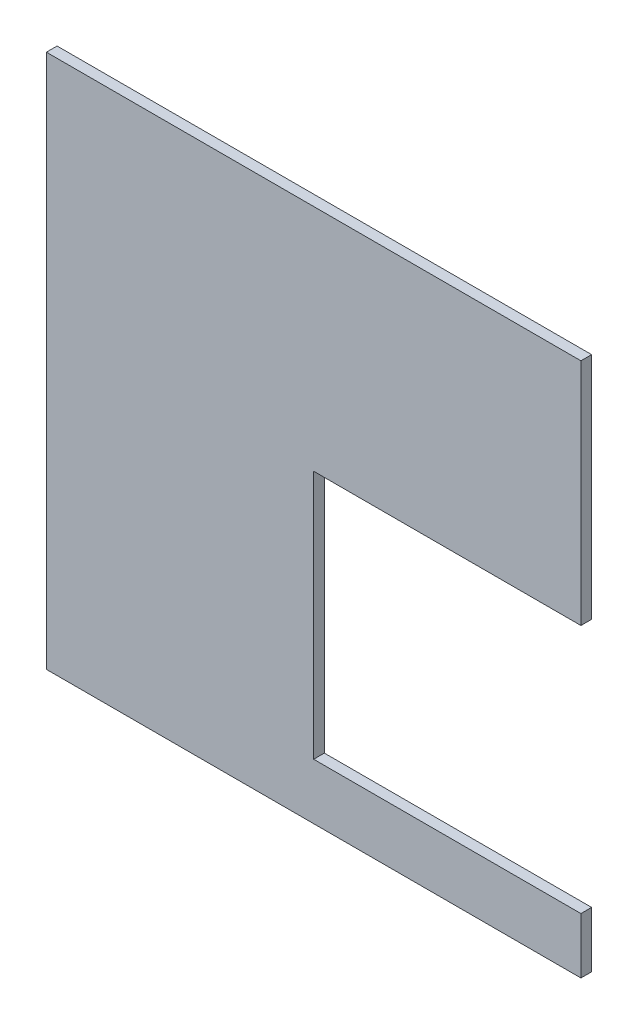
ISO-10303-21;
HEADER;
FILE_DESCRIPTION(('STEP AP214'),'2;1');
FILE_NAME('part.step','',(''),(''),'','','');
FILE_SCHEMA(('AUTOMOTIVE_DESIGN { 1 0 10303 214 1 1 1 1 }'));
ENDSEC;
DATA;
#1=APPLICATION_CONTEXT('core data for automotive mechanical design processes');
#2=APPLICATION_PROTOCOL_DEFINITION('international standard','automotive_design',2000,#1);
#3=PRODUCT_CONTEXT('',#1,'mechanical');
#4=PRODUCT('Part','Part','',(#3));
#5=PRODUCT_RELATED_PRODUCT_CATEGORY('part','',(#4));
#6=PRODUCT_DEFINITION_FORMATION('','',#4);
#7=PRODUCT_DEFINITION_CONTEXT('part definition',#1,'design');
#8=PRODUCT_DEFINITION('design','',#6,#7);
#9=PRODUCT_DEFINITION_SHAPE('','',#8);
#10=(LENGTH_UNIT() NAMED_UNIT(*) SI_UNIT(.MILLI.,.METRE.));
#11=(NAMED_UNIT(*) PLANE_ANGLE_UNIT() SI_UNIT($,.RADIAN.));
#12=(NAMED_UNIT(*) SI_UNIT($,.STERADIAN.) SOLID_ANGLE_UNIT());
#13=UNCERTAINTY_MEASURE_WITH_UNIT(LENGTH_MEASURE(1.E-05),#10,'distance_accuracy_value','');
#14=(GEOMETRIC_REPRESENTATION_CONTEXT(3) GLOBAL_UNCERTAINTY_ASSIGNED_CONTEXT((#13)) GLOBAL_UNIT_ASSIGNED_CONTEXT((#10,
#11,#12)) REPRESENTATION_CONTEXT('',''));
#15=CARTESIAN_POINT('',(0.,0.,0.));
#16=DIRECTION('',(0.,0.,1.));
#17=DIRECTION('',(1.,0.,0.));
#18=AXIS2_PLACEMENT_3D('',#15,#16,#17);
#19=CARTESIAN_POINT('',(75.,-75.,3.));
#20=DIRECTION('',(-1.,0.,0.));
#21=DIRECTION('',(0.,0.,1.));
#22=AXIS2_PLACEMENT_3D('',#19,#20,#21);
#23=PLANE('',#22);
#24=DIRECTION('',(0.,1.,0.));
#25=VECTOR('',#24,1.);
#26=CARTESIAN_POINT('',(75.,-75.,0.));
#27=LINE('',#26,#25);
#28=CARTESIAN_POINT('',(75.,-75.,0.));
#29=VERTEX_POINT('',#28);
#30=CARTESIAN_POINT('',(75.,-59.3380306855874,0.));
#31=VERTEX_POINT('',#30);
#32=EDGE_CURVE('E127',#29,#31,#27,.T.);
#33=ORIENTED_EDGE('',*,*,#32,.T.);
#34=DIRECTION('',(0.,0.,1.));
#35=VECTOR('',#34,1.);
#36=CARTESIAN_POINT('',(75.,-59.3380306855874,0.));
#37=LINE('',#36,#35);
#38=CARTESIAN_POINT('',(75.,-59.3380306855874,3.));
#39=VERTEX_POINT('',#38);
#40=EDGE_CURVE('E159',#31,#39,#37,.T.);
#41=ORIENTED_EDGE('',*,*,#40,.T.);
#42=DIRECTION('',(0.,1.,0.));
#43=VECTOR('',#42,1.);
#44=CARTESIAN_POINT('',(75.,-75.,3.));
#45=LINE('',#44,#43);
#46=CARTESIAN_POINT('',(75.,-75.,3.));
#47=VERTEX_POINT('',#46);
#48=EDGE_CURVE('E146',#47,#39,#45,.T.);
#49=ORIENTED_EDGE('',*,*,#48,.F.);
#50=DIRECTION('',(0.,0.,-1.));
#51=VECTOR('',#50,1.);
#52=CARTESIAN_POINT('',(75.,-75.,3.));
#53=LINE('',#52,#51);
#54=EDGE_CURVE('E41',#47,#29,#53,.T.);
#55=ORIENTED_EDGE('',*,*,#54,.T.);
#56=EDGE_LOOP('',(#33,#41,#49,#55));
#57=FACE_BOUND('',#56,.T.);
#58=ADVANCED_FACE('F33',(#57),#23,.F.);
#59=CARTESIAN_POINT('',(-75.,-75.,3.));
#60=DIRECTION('',(1.,0.,0.));
#61=DIRECTION('',(0.,1.,0.));
#62=AXIS2_PLACEMENT_3D('',#59,#60,#61);
#63=PLANE('',#62);
#64=DIRECTION('',(0.,-1.,0.));
#65=VECTOR('',#64,1.);
#66=CARTESIAN_POINT('',(-75.,-75.,0.));
#67=LINE('',#66,#65);
#68=CARTESIAN_POINT('',(-75.,75.,0.));
#69=VERTEX_POINT('',#68);
#70=CARTESIAN_POINT('',(-75.,-75.,0.));
#71=VERTEX_POINT('',#70);
#72=EDGE_CURVE('E131',#69,#71,#67,.T.);
#73=ORIENTED_EDGE('',*,*,#72,.T.);
#74=DIRECTION('',(0.,0.,-1.));
#75=VECTOR('',#74,1.);
#76=CARTESIAN_POINT('',(-75.,-75.,3.));
#77=LINE('',#76,#75);
#78=CARTESIAN_POINT('',(-75.,-75.,3.));
#79=VERTEX_POINT('',#78);
#80=EDGE_CURVE('E11',#79,#71,#77,.T.);
#81=ORIENTED_EDGE('',*,*,#80,.F.);
#82=DIRECTION('',(0.,-1.,0.));
#83=VECTOR('',#82,1.);
#84=CARTESIAN_POINT('',(-75.,-75.,3.));
#85=LINE('',#84,#83);
#86=CARTESIAN_POINT('',(-75.,75.,3.));
#87=VERTEX_POINT('',#86);
#88=EDGE_CURVE('E136',#87,#79,#85,.T.);
#89=ORIENTED_EDGE('',*,*,#88,.F.);
#90=DIRECTION('',(0.,0.,-1.));
#91=VECTOR('',#90,1.);
#92=CARTESIAN_POINT('',(-75.,75.,3.));
#93=LINE('',#92,#91);
#94=EDGE_CURVE('E137',#87,#69,#93,.T.);
#95=ORIENTED_EDGE('',*,*,#94,.T.);
#96=EDGE_LOOP('',(#73,#81,#89,#95));
#97=FACE_BOUND('',#96,.T.);
#98=ADVANCED_FACE('F35',(#97),#63,.F.);
#99=CARTESIAN_POINT('',(75.,-75.,3.));
#100=DIRECTION('',(0.,1.,0.));
#101=DIRECTION('',(-1.,0.,0.));
#102=AXIS2_PLACEMENT_3D('',#99,#100,#101);
#103=PLANE('',#102);
#104=DIRECTION('',(1.,0.,0.));
#105=VECTOR('',#104,1.);
#106=CARTESIAN_POINT('',(75.,-75.,0.));
#107=LINE('',#106,#105);
#108=EDGE_CURVE('E128',#71,#29,#107,.T.);
#109=ORIENTED_EDGE('',*,*,#108,.T.);
#110=ORIENTED_EDGE('',*,*,#54,.F.);
#111=DIRECTION('',(1.,0.,0.));
#112=VECTOR('',#111,1.);
#113=CARTESIAN_POINT('',(75.,-75.,3.));
#114=LINE('',#113,#112);
#115=EDGE_CURVE('E85',#79,#47,#114,.T.);
#116=ORIENTED_EDGE('',*,*,#115,.F.);
#117=ORIENTED_EDGE('',*,*,#80,.T.);
#118=EDGE_LOOP('',(#109,#110,#116,#117));
#119=FACE_BOUND('',#118,.T.);
#120=ADVANCED_FACE('F180',(#119),#103,.F.);
#121=CARTESIAN_POINT('',(75.,10.6619693144168,3.));
#122=VERTEX_POINT('',#121);
#123=CARTESIAN_POINT('',(75.,75.,3.));
#124=VERTEX_POINT('',#123);
#125=EDGE_CURVE('E122',#122,#124,#45,.T.);
#126=ORIENTED_EDGE('',*,*,#125,.F.);
#127=DIRECTION('',(0.,0.,1.));
#128=VECTOR('',#127,1.);
#129=CARTESIAN_POINT('',(75.,10.6619693144168,0.));
#130=LINE('',#129,#128);
#131=CARTESIAN_POINT('',(75.,10.6619693144168,0.));
#132=VERTEX_POINT('',#131);
#133=EDGE_CURVE('E110',#132,#122,#130,.T.);
#134=ORIENTED_EDGE('',*,*,#133,.F.);
#135=CARTESIAN_POINT('',(75.,75.,0.));
#136=VERTEX_POINT('',#135);
#137=EDGE_CURVE('E121',#132,#136,#27,.T.);
#138=ORIENTED_EDGE('',*,*,#137,.T.);
#139=DIRECTION('',(0.,0.,-1.));
#140=VECTOR('',#139,1.);
#141=CARTESIAN_POINT('',(75.,75.,3.));
#142=LINE('',#141,#140);
#143=EDGE_CURVE('E139',#124,#136,#142,.T.);
#144=ORIENTED_EDGE('',*,*,#143,.F.);
#145=EDGE_LOOP('',(#126,#134,#138,#144));
#146=FACE_BOUND('',#145,.T.);
#147=ADVANCED_FACE('F119',(#146),#23,.F.);
#148=CARTESIAN_POINT('',(75.,75.,3.));
#149=DIRECTION('',(0.,-1.,0.));
#150=DIRECTION('',(1.,0.,0.));
#151=AXIS2_PLACEMENT_3D('',#148,#149,#150);
#152=PLANE('',#151);
#153=DIRECTION('',(-1.,0.,0.));
#154=VECTOR('',#153,1.);
#155=CARTESIAN_POINT('',(75.,75.,0.));
#156=LINE('',#155,#154);
#157=EDGE_CURVE('E78',#136,#69,#156,.T.);
#158=ORIENTED_EDGE('',*,*,#157,.T.);
#159=ORIENTED_EDGE('',*,*,#94,.F.);
#160=DIRECTION('',(-1.,0.,0.));
#161=VECTOR('',#160,1.);
#162=CARTESIAN_POINT('',(75.,75.,3.));
#163=LINE('',#162,#161);
#164=EDGE_CURVE('E57',#124,#87,#163,.T.);
#165=ORIENTED_EDGE('',*,*,#164,.F.);
#166=ORIENTED_EDGE('',*,*,#143,.T.);
#167=EDGE_LOOP('',(#158,#159,#165,#166));
#168=FACE_BOUND('',#167,.T.);
#169=ADVANCED_FACE('F171',(#168),#152,.F.);
#170=CARTESIAN_POINT('',(0.,0.,3.));
#171=DIRECTION('',(0.,0.,1.));
#172=DIRECTION('',(1.,0.,0.));
#173=AXIS2_PLACEMENT_3D('',#170,#171,#172);
#174=PLANE('',#173);
#175=DIRECTION('',(1.,0.,0.));
#176=VECTOR('',#175,1.);
#177=CARTESIAN_POINT('',(0.,-59.3380306855874,3.));
#178=LINE('',#177,#176);
#179=CARTESIAN_POINT('',(0.,-59.3380306855874,3.));
#180=VERTEX_POINT('',#179);
#181=EDGE_CURVE('E115',#180,#39,#178,.T.);
#182=ORIENTED_EDGE('',*,*,#181,.F.);
#183=DIRECTION('',(0.,-1.,0.));
#184=VECTOR('',#183,1.);
#185=CARTESIAN_POINT('',(0.,10.6619693144168,3.));
#186=LINE('',#185,#184);
#187=CARTESIAN_POINT('',(0.,10.6619693144168,3.));
#188=VERTEX_POINT('',#187);
#189=EDGE_CURVE('E155',#188,#180,#186,.T.);
#190=ORIENTED_EDGE('',*,*,#189,.F.);
#191=DIRECTION('',(-1.,0.,0.));
#192=VECTOR('',#191,1.);
#193=CARTESIAN_POINT('',(0.,10.6619693144168,3.));
#194=LINE('',#193,#192);
#195=EDGE_CURVE('E153',#122,#188,#194,.T.);
#196=ORIENTED_EDGE('',*,*,#195,.F.);
#197=ORIENTED_EDGE('',*,*,#125,.T.);
#198=ORIENTED_EDGE('',*,*,#164,.T.);
#199=ORIENTED_EDGE('',*,*,#88,.T.);
#200=ORIENTED_EDGE('',*,*,#115,.T.);
#201=ORIENTED_EDGE('',*,*,#48,.T.);
#202=EDGE_LOOP('',(#182,#190,#196,#197,#198,#199,#200,#201));
#203=FACE_BOUND('',#202,.T.);
#204=ADVANCED_FACE('F173',(#203),#174,.T.);
#205=CARTESIAN_POINT('',(0.,0.,0.));
#206=DIRECTION('',(0.,0.,1.));
#207=DIRECTION('',(1.,0.,0.));
#208=AXIS2_PLACEMENT_3D('',#205,#206,#207);
#209=PLANE('',#208);
#210=DIRECTION('',(0.,-1.,0.));
#211=VECTOR('',#210,1.);
#212=CARTESIAN_POINT('',(0.,10.6619693144168,0.));
#213=LINE('',#212,#211);
#214=CARTESIAN_POINT('',(0.,10.6619693144168,0.));
#215=VERTEX_POINT('',#214);
#216=CARTESIAN_POINT('',(0.,-59.3380306855874,0.));
#217=VERTEX_POINT('',#216);
#218=EDGE_CURVE('E48',#215,#217,#213,.T.);
#219=ORIENTED_EDGE('',*,*,#218,.T.);
#220=DIRECTION('',(1.,0.,0.));
#221=VECTOR('',#220,1.);
#222=CARTESIAN_POINT('',(0.,-59.3380306855874,0.));
#223=LINE('',#222,#221);
#224=EDGE_CURVE('E123',#217,#31,#223,.T.);
#225=ORIENTED_EDGE('',*,*,#224,.T.);
#226=ORIENTED_EDGE('',*,*,#32,.F.);
#227=ORIENTED_EDGE('',*,*,#108,.F.);
#228=ORIENTED_EDGE('',*,*,#72,.F.);
#229=ORIENTED_EDGE('',*,*,#157,.F.);
#230=ORIENTED_EDGE('',*,*,#137,.F.);
#231=DIRECTION('',(-1.,0.,0.));
#232=VECTOR('',#231,1.);
#233=CARTESIAN_POINT('',(0.,10.6619693144168,0.));
#234=LINE('',#233,#232);
#235=EDGE_CURVE('E106',#132,#215,#234,.T.);
#236=ORIENTED_EDGE('',*,*,#235,.T.);
#237=EDGE_LOOP('',(#219,#225,#226,#227,#228,#229,#230,#236));
#238=FACE_BOUND('',#237,.T.);
#239=ADVANCED_FACE('F125',(#238),#209,.F.);
#240=CARTESIAN_POINT('',(0.,-59.3380306855874,0.));
#241=DIRECTION('',(0.,-1.,0.));
#242=DIRECTION('',(0.,0.,-1.));
#243=AXIS2_PLACEMENT_3D('',#240,#241,#242);
#244=PLANE('',#243);
#245=ORIENTED_EDGE('',*,*,#181,.T.);
#246=ORIENTED_EDGE('',*,*,#40,.F.);
#247=ORIENTED_EDGE('',*,*,#224,.F.);
#248=DIRECTION('',(0.,0.,1.));
#249=VECTOR('',#248,1.);
#250=CARTESIAN_POINT('',(0.,-59.3380306855874,0.));
#251=LINE('',#250,#249);
#252=EDGE_CURVE('E161',#217,#180,#251,.T.);
#253=ORIENTED_EDGE('',*,*,#252,.T.);
#254=EDGE_LOOP('',(#245,#246,#247,#253));
#255=FACE_BOUND('',#254,.T.);
#256=ADVANCED_FACE('F214',(#255),#244,.F.);
#257=CARTESIAN_POINT('',(0.,10.6619693144168,0.));
#258=DIRECTION('',(-1.,0.,0.));
#259=DIRECTION('',(0.,-1.,0.));
#260=AXIS2_PLACEMENT_3D('',#257,#258,#259);
#261=PLANE('',#260);
#262=ORIENTED_EDGE('',*,*,#189,.T.);
#263=ORIENTED_EDGE('',*,*,#252,.F.);
#264=ORIENTED_EDGE('',*,*,#218,.F.);
#265=DIRECTION('',(0.,0.,1.));
#266=VECTOR('',#265,1.);
#267=CARTESIAN_POINT('',(0.,10.6619693144168,0.));
#268=LINE('',#267,#266);
#269=EDGE_CURVE('E112',#215,#188,#268,.T.);
#270=ORIENTED_EDGE('',*,*,#269,.T.);
#271=EDGE_LOOP('',(#262,#263,#264,#270));
#272=FACE_BOUND('',#271,.T.);
#273=ADVANCED_FACE('F222',(#272),#261,.F.);
#274=CARTESIAN_POINT('',(0.,10.6619693144168,0.));
#275=DIRECTION('',(0.,1.,0.));
#276=DIRECTION('',(0.,0.,1.));
#277=AXIS2_PLACEMENT_3D('',#274,#275,#276);
#278=PLANE('',#277);
#279=ORIENTED_EDGE('',*,*,#195,.T.);
#280=ORIENTED_EDGE('',*,*,#269,.F.);
#281=ORIENTED_EDGE('',*,*,#235,.F.);
#282=ORIENTED_EDGE('',*,*,#133,.T.);
#283=EDGE_LOOP('',(#279,#280,#281,#282));
#284=FACE_BOUND('',#283,.T.);
#285=ADVANCED_FACE('F109',(#284),#278,.F.);
#286=CLOSED_SHELL('',(#58,#98,#120,#147,#169,#204,#239,#256,#273,#285));
#287=MANIFOLD_SOLID_BREP('B2',#286);
#288=ADVANCED_BREP_SHAPE_REPRESENTATION('',(#18,#287),#14);
#289=SHAPE_DEFINITION_REPRESENTATION(#9,#288);
ENDSEC;
END-ISO-10303-21;
